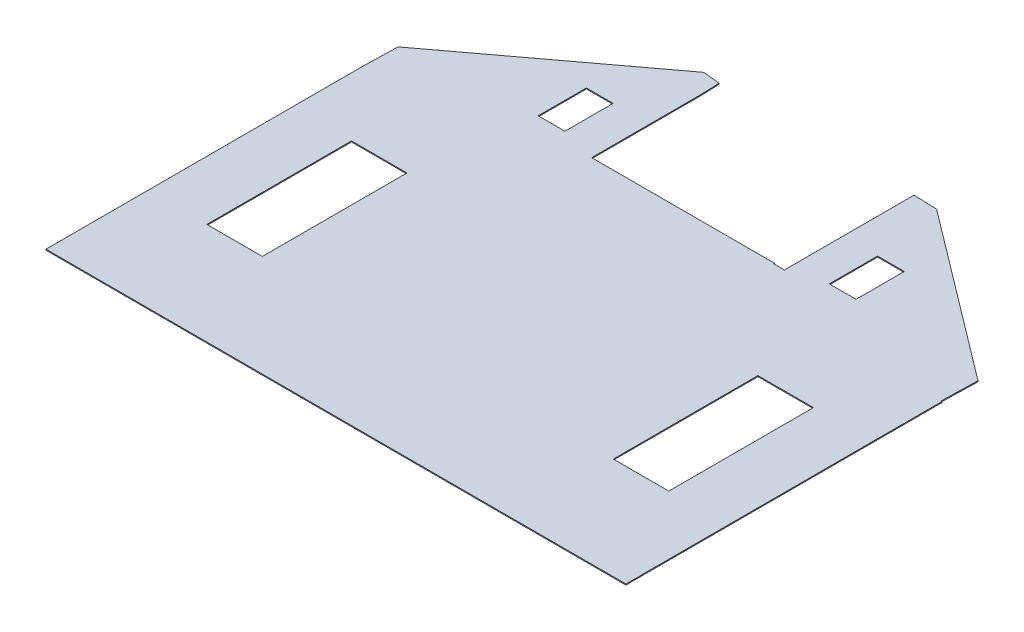
ISO-10303-21;
HEADER;
FILE_DESCRIPTION(('STEP AP214'),'2;1');
FILE_NAME('part.step','',(''),(''),'','','');
FILE_SCHEMA(('AUTOMOTIVE_DESIGN { 1 0 10303 214 1 1 1 1 }'));
ENDSEC;
DATA;
#1=APPLICATION_CONTEXT('core data for automotive mechanical design processes');
#2=APPLICATION_PROTOCOL_DEFINITION('international standard','automotive_design',2000,#1);
#3=PRODUCT_CONTEXT('',#1,'mechanical');
#4=PRODUCT('Part','Part','',(#3));
#5=PRODUCT_RELATED_PRODUCT_CATEGORY('part','',(#4));
#6=PRODUCT_DEFINITION_FORMATION('','',#4);
#7=PRODUCT_DEFINITION_CONTEXT('part definition',#1,'design');
#8=PRODUCT_DEFINITION('design','',#6,#7);
#9=PRODUCT_DEFINITION_SHAPE('','',#8);
#10=(LENGTH_UNIT() NAMED_UNIT(*) SI_UNIT(.MILLI.,.METRE.));
#11=(NAMED_UNIT(*) PLANE_ANGLE_UNIT() SI_UNIT($,.RADIAN.));
#12=(NAMED_UNIT(*) SI_UNIT($,.STERADIAN.) SOLID_ANGLE_UNIT());
#13=UNCERTAINTY_MEASURE_WITH_UNIT(LENGTH_MEASURE(1.E-05),#10,'distance_accuracy_value','');
#14=(GEOMETRIC_REPRESENTATION_CONTEXT(3) GLOBAL_UNCERTAINTY_ASSIGNED_CONTEXT((#13)) GLOBAL_UNIT_ASSIGNED_CONTEXT((#10,
#11,#12)) REPRESENTATION_CONTEXT('',''));
#15=CARTESIAN_POINT('',(0.,0.,0.));
#16=DIRECTION('',(0.,0.,1.));
#17=DIRECTION('',(1.,0.,0.));
#18=AXIS2_PLACEMENT_3D('',#15,#16,#17);
#19=CARTESIAN_POINT('',(0.,1.,0.));
#20=DIRECTION('',(0.,-1.,0.));
#21=DIRECTION('',(0.,0.,-1.));
#22=AXIS2_PLACEMENT_3D('',#19,#20,#21);
#23=PLANE('',#22);
#24=DIRECTION('',(-1.,0.,0.));
#25=VECTOR('',#24,1.);
#26=CARTESIAN_POINT('',(0.,1.,-343.519296460177));
#27=LINE('',#26,#25);
#28=CARTESIAN_POINT('',(98.6389999999998,1.,-343.519296460177));
#29=VERTEX_POINT('',#28);
#30=CARTESIAN_POINT('',(87.7500000000001,1.,-343.519296460177));
#31=VERTEX_POINT('',#30);
#32=EDGE_CURVE('E274',#29,#31,#27,.T.);
#33=ORIENTED_EDGE('',*,*,#32,.T.);
#34=DIRECTION('',(0.,0.,-1.));
#35=VECTOR('',#34,1.);
#36=CARTESIAN_POINT('',(87.7500000000001,1.,0.));
#37=LINE('',#36,#35);
#38=CARTESIAN_POINT('',(87.7500000000001,1.,-344.408296460177));
#39=VERTEX_POINT('',#38);
#40=EDGE_CURVE('E250',#31,#39,#37,.T.);
#41=ORIENTED_EDGE('',*,*,#40,.T.);
#42=DIRECTION('',(1.,0.,0.));
#43=VECTOR('',#42,1.);
#44=CARTESIAN_POINT('',(0.,1.,-344.408296460177));
#45=LINE('',#44,#43);
#46=CARTESIAN_POINT('',(-96.8500000000001,1.,-344.408296460177));
#47=VERTEX_POINT('',#46);
#48=EDGE_CURVE('E402',#47,#39,#45,.T.);
#49=ORIENTED_EDGE('',*,*,#48,.F.);
#50=DIRECTION('',(0.,0.,1.));
#51=VECTOR('',#50,1.);
#52=CARTESIAN_POINT('',(-96.8500000000001,1.,0.));
#53=LINE('',#52,#51);
#54=CARTESIAN_POINT('',(-96.8500000000002,1.,-453.596650434538));
#55=VERTEX_POINT('',#54);
#56=EDGE_CURVE('E405',#55,#47,#53,.T.);
#57=ORIENTED_EDGE('',*,*,#56,.F.);
#58=DIRECTION('',(-0.0366905336563942,0.,-0.999326675687189));
#59=VECTOR('',#58,1.);
#60=CARTESIAN_POINT('',(-97.5901578831756,1.,-473.756060592055));
#61=LINE('',#60,#59);
#62=CARTESIAN_POINT('',(-97.5901578831756,1.,-473.756060592055));
#63=VERTEX_POINT('',#62);
#64=EDGE_CURVE('E297',#55,#63,#61,.T.);
#65=ORIENTED_EDGE('',*,*,#64,.T.);
#66=DIRECTION('',(-0.994284052358785,0.,-0.106767144876095));
#67=VECTOR('',#66,1.);
#68=CARTESIAN_POINT('',(-114.760549692104,1.,-475.599833209643));
#69=LINE('',#68,#67);
#70=CARTESIAN_POINT('',(-114.760549692104,1.,-475.599833209643));
#71=VERTEX_POINT('',#70);
#72=EDGE_CURVE('E315',#63,#71,#69,.T.);
#73=ORIENTED_EDGE('',*,*,#72,.T.);
#74=DIRECTION('',(-0.80080418365876,0.,0.598926255422675));
#75=VECTOR('',#74,1.);
#76=CARTESIAN_POINT('',(-291.361,1.,-343.519296460177));
#77=LINE('',#76,#75);
#78=CARTESIAN_POINT('',(-291.361,1.,-343.519296460177));
#79=VERTEX_POINT('',#78);
#80=EDGE_CURVE('E318',#71,#79,#77,.T.);
#81=ORIENTED_EDGE('',*,*,#80,.T.);
#82=DIRECTION('',(-0.0249634267738826,0.,0.999688365103698));
#83=VECTOR('',#82,1.);
#84=CARTESIAN_POINT('',(-292.25,1.,-307.918296460177));
#85=LINE('',#84,#83);
#86=CARTESIAN_POINT('',(-292.25,1.,-307.918296460177));
#87=VERTEX_POINT('',#86);
#88=EDGE_CURVE('E303',#79,#87,#85,.T.);
#89=ORIENTED_EDGE('',*,*,#88,.T.);
#90=DIRECTION('',(0.,0.,1.));
#91=VECTOR('',#90,1.);
#92=CARTESIAN_POINT('',(-292.25,1.,-307.918296460177));
#93=LINE('',#92,#91);
#94=CARTESIAN_POINT('',(-292.25,1.,10.991703539823));
#95=VERTEX_POINT('',#94);
#96=EDGE_CURVE('E464',#87,#95,#93,.T.);
#97=ORIENTED_EDGE('',*,*,#96,.T.);
#98=DIRECTION('',(1.,0.,0.));
#99=VECTOR('',#98,1.);
#100=CARTESIAN_POINT('',(-292.25,1.,10.991703539823));
#101=LINE('',#100,#99);
#102=CARTESIAN_POINT('',(293.15,1.,10.9917035398231));
#103=VERTEX_POINT('',#102);
#104=EDGE_CURVE('E466',#95,#103,#101,.T.);
#105=ORIENTED_EDGE('',*,*,#104,.T.);
#106=DIRECTION('',(0.,0.,-1.));
#107=VECTOR('',#106,1.);
#108=CARTESIAN_POINT('',(293.15,1.,-307.918296460177));
#109=LINE('',#108,#107);
#110=CARTESIAN_POINT('',(293.15,1.,-307.918296460177));
#111=VERTEX_POINT('',#110);
#112=EDGE_CURVE('E407',#103,#111,#109,.T.);
#113=ORIENTED_EDGE('',*,*,#112,.T.);
#114=DIRECTION('',(-1.,0.,0.));
#115=VECTOR('',#114,1.);
#116=CARTESIAN_POINT('',(292.25,1.,-307.918296460177));
#117=LINE('',#116,#115);
#118=CARTESIAN_POINT('',(292.25,1.,-307.918296460177));
#119=VERTEX_POINT('',#118);
#120=EDGE_CURVE('E408',#111,#119,#117,.T.);
#121=ORIENTED_EDGE('',*,*,#120,.T.);
#122=DIRECTION('',(0.0246567930270433,0.,-0.99969597506323));
#123=VECTOR('',#122,1.);
#124=CARTESIAN_POINT('',(293.15,1.,-344.408296460177));
#125=LINE('',#124,#123);
#126=CARTESIAN_POINT('',(293.15,1.,-344.408296460177));
#127=VERTEX_POINT('',#126);
#128=EDGE_CURVE('E276',#119,#127,#125,.T.);
#129=ORIENTED_EDGE('',*,*,#128,.T.);
#130=DIRECTION('',(-0.797878851672982,0.,-0.602817831565228));
#131=VECTOR('',#130,1.);
#132=CARTESIAN_POINT('',(122.261,1.,-473.519296460177));
#133=LINE('',#132,#131);
#134=CARTESIAN_POINT('',(122.261,1.,-473.519296460177));
#135=VERTEX_POINT('',#134);
#136=EDGE_CURVE('E290',#127,#135,#133,.T.);
#137=ORIENTED_EDGE('',*,*,#136,.T.);
#138=DIRECTION('',(-0.999436890537018,0.,-0.0335544607123688));
#139=VECTOR('',#138,1.);
#140=CARTESIAN_POINT('',(87.7500000000001,1.,-474.677946900849));
#141=LINE('',#140,#139);
#142=CARTESIAN_POINT('',(98.6389999999998,1.,-474.312366516378));
#143=VERTEX_POINT('',#142);
#144=EDGE_CURVE('E281',#135,#143,#141,.T.);
#145=ORIENTED_EDGE('',*,*,#144,.T.);
#146=DIRECTION('',(0.,0.,1.));
#147=VECTOR('',#146,1.);
#148=CARTESIAN_POINT('',(98.6389999999998,1.,0.));
#149=LINE('',#148,#147);
#150=EDGE_CURVE('E49',#143,#29,#149,.T.);
#151=ORIENTED_EDGE('',*,*,#150,.T.);
#152=EDGE_LOOP('',(#33,#41,#49,#57,#65,#73,#81,#89,#97,#105,#113,#121,#129,#137,#145,#151));
#153=FACE_BOUND('',#152,.T.);
#154=DIRECTION('',(-1.,0.,0.));
#155=VECTOR('',#154,1.);
#156=CARTESIAN_POINT('',(0.,1.,-354.012796511557));
#157=LINE('',#156,#155);
#158=CARTESIAN_POINT('',(-133.445577184757,1.,-354.012796511557));
#159=VERTEX_POINT('',#158);
#160=CARTESIAN_POINT('',(-160.445577184757,1.,-354.012796511557));
#161=VERTEX_POINT('',#160);
#162=EDGE_CURVE('E385',#159,#161,#157,.T.);
#163=ORIENTED_EDGE('',*,*,#162,.T.);
#164=DIRECTION('',(0.,0.,-1.));
#165=VECTOR('',#164,1.);
#166=CARTESIAN_POINT('',(-160.445577184757,1.,0.));
#167=LINE('',#166,#165);
#168=CARTESIAN_POINT('',(-160.445577184757,1.,-402.725815016483));
#169=VERTEX_POINT('',#168);
#170=EDGE_CURVE('E394',#161,#169,#167,.T.);
#171=ORIENTED_EDGE('',*,*,#170,.T.);
#172=DIRECTION('',(1.,0.,0.));
#173=VECTOR('',#172,1.);
#174=CARTESIAN_POINT('',(0.,1.,-402.725815016483));
#175=LINE('',#174,#173);
#176=CARTESIAN_POINT('',(-133.445577184757,1.,-402.725815016483));
#177=VERTEX_POINT('',#176);
#178=EDGE_CURVE('E391',#169,#177,#175,.T.);
#179=ORIENTED_EDGE('',*,*,#178,.T.);
#180=DIRECTION('',(0.,0.,1.));
#181=VECTOR('',#180,1.);
#182=CARTESIAN_POINT('',(-133.445577184757,1.,0.));
#183=LINE('',#182,#181);
#184=EDGE_CURVE('E388',#177,#159,#183,.T.);
#185=ORIENTED_EDGE('',*,*,#184,.T.);
#186=EDGE_LOOP('',(#163,#171,#179,#185));
#187=FACE_BOUND('',#186,.T.);
#188=DIRECTION('',(1.,0.,0.));
#189=VECTOR('',#188,1.);
#190=CARTESIAN_POINT('',(0.,1.,-402.725815016483));
#191=LINE('',#190,#189);
#192=CARTESIAN_POINT('',(133.445577184757,1.,-402.725815016483));
#193=VERTEX_POINT('',#192);
#194=CARTESIAN_POINT('',(160.445577184757,1.,-402.725815016483));
#195=VERTEX_POINT('',#194);
#196=EDGE_CURVE('E345',#193,#195,#191,.T.);
#197=ORIENTED_EDGE('',*,*,#196,.T.);
#198=DIRECTION('',(0.,0.,1.));
#199=VECTOR('',#198,1.);
#200=CARTESIAN_POINT('',(160.445577184757,1.,0.));
#201=LINE('',#200,#199);
#202=CARTESIAN_POINT('',(160.445577184757,1.,-354.012796511557));
#203=VERTEX_POINT('',#202);
#204=EDGE_CURVE('E382',#195,#203,#201,.T.);
#205=ORIENTED_EDGE('',*,*,#204,.T.);
#206=DIRECTION('',(-1.,0.,0.));
#207=VECTOR('',#206,1.);
#208=CARTESIAN_POINT('',(0.,1.,-354.012796511557));
#209=LINE('',#208,#207);
#210=CARTESIAN_POINT('',(133.445577184757,1.,-354.012796511557));
#211=VERTEX_POINT('',#210);
#212=EDGE_CURVE('E379',#203,#211,#209,.T.);
#213=ORIENTED_EDGE('',*,*,#212,.T.);
#214=DIRECTION('',(0.,0.,-1.));
#215=VECTOR('',#214,1.);
#216=CARTESIAN_POINT('',(133.445577184757,1.,0.));
#217=LINE('',#216,#215);
#218=EDGE_CURVE('E376',#211,#193,#217,.T.);
#219=ORIENTED_EDGE('',*,*,#218,.T.);
#220=EDGE_LOOP('',(#197,#205,#213,#219));
#221=FACE_BOUND('',#220,.T.);
#222=DIRECTION('',(1.,0.,0.));
#223=VECTOR('',#222,1.);
#224=CARTESIAN_POINT('',(177.588244908517,1.,-91.8344648344604));
#225=LINE('',#224,#223);
#226=CARTESIAN_POINT('',(177.588244908517,1.,-91.8344648344604));
#227=VERTEX_POINT('',#226);
#228=CARTESIAN_POINT('',(233.588244908517,1.,-91.8344648344604));
#229=VERTEX_POINT('',#228);
#230=EDGE_CURVE('E447',#227,#229,#225,.T.);
#231=ORIENTED_EDGE('',*,*,#230,.F.);
#232=DIRECTION('',(0.,0.,1.));
#233=VECTOR('',#232,1.);
#234=CARTESIAN_POINT('',(177.588244908517,1.,-237.83446483446));
#235=LINE('',#234,#233);
#236=CARTESIAN_POINT('',(177.588244908517,1.,-237.83446483446));
#237=VERTEX_POINT('',#236);
#238=EDGE_CURVE('E416',#237,#227,#235,.T.);
#239=ORIENTED_EDGE('',*,*,#238,.F.);
#240=DIRECTION('',(-1.,0.,0.));
#241=VECTOR('',#240,1.);
#242=CARTESIAN_POINT('',(177.588244908517,1.,-237.83446483446));
#243=LINE('',#242,#241);
#244=CARTESIAN_POINT('',(233.588244908517,1.,-237.83446483446));
#245=VERTEX_POINT('',#244);
#246=EDGE_CURVE('E453',#245,#237,#243,.T.);
#247=ORIENTED_EDGE('',*,*,#246,.F.);
#248=DIRECTION('',(0.,0.,-1.));
#249=VECTOR('',#248,1.);
#250=CARTESIAN_POINT('',(233.588244908517,1.,-237.83446483446));
#251=LINE('',#250,#249);
#252=EDGE_CURVE('E450',#229,#245,#251,.T.);
#253=ORIENTED_EDGE('',*,*,#252,.F.);
#254=EDGE_LOOP('',(#231,#239,#247,#253));
#255=FACE_BOUND('',#254,.T.);
#256=DIRECTION('',(1.,0.,0.));
#257=VECTOR('',#256,1.);
#258=CARTESIAN_POINT('',(-232.688244908518,1.,-91.8344648344604));
#259=LINE('',#258,#257);
#260=CARTESIAN_POINT('',(-232.688244908518,1.,-91.8344648344604));
#261=VERTEX_POINT('',#260);
#262=CARTESIAN_POINT('',(-176.688244908518,1.,-91.8344648344604));
#263=VERTEX_POINT('',#262);
#264=EDGE_CURVE('E426',#261,#263,#259,.T.);
#265=ORIENTED_EDGE('',*,*,#264,.F.);
#266=DIRECTION('',(0.,0.,1.));
#267=VECTOR('',#266,1.);
#268=CARTESIAN_POINT('',(-232.688244908518,1.,-237.83446483446));
#269=LINE('',#268,#267);
#270=CARTESIAN_POINT('',(-232.688244908518,1.,-237.83446483446));
#271=VERTEX_POINT('',#270);
#272=EDGE_CURVE('E424',#271,#261,#269,.T.);
#273=ORIENTED_EDGE('',*,*,#272,.F.);
#274=DIRECTION('',(-1.,0.,0.));
#275=VECTOR('',#274,1.);
#276=CARTESIAN_POINT('',(-232.688244908518,1.,-237.83446483446));
#277=LINE('',#276,#275);
#278=CARTESIAN_POINT('',(-176.688244908518,1.,-237.83446483446));
#279=VERTEX_POINT('',#278);
#280=EDGE_CURVE('E433',#279,#271,#277,.T.);
#281=ORIENTED_EDGE('',*,*,#280,.F.);
#282=DIRECTION('',(0.,0.,-1.));
#283=VECTOR('',#282,1.);
#284=CARTESIAN_POINT('',(-176.688244908518,1.,-237.83446483446));
#285=LINE('',#284,#283);
#286=EDGE_CURVE('E430',#263,#279,#285,.T.);
#287=ORIENTED_EDGE('',*,*,#286,.F.);
#288=EDGE_LOOP('',(#265,#273,#281,#287));
#289=FACE_BOUND('',#288,.T.);
#290=ADVANCED_FACE('F35',(#153,#187,#221,#255,#289),#23,.F.);
#291=CARTESIAN_POINT('',(0.,0.,0.));
#292=DIRECTION('',(0.,-1.,0.));
#293=DIRECTION('',(0.,0.,-1.));
#294=AXIS2_PLACEMENT_3D('',#291,#292,#293);
#295=PLANE('',#294);
#296=DIRECTION('',(0.,0.,1.));
#297=VECTOR('',#296,1.);
#298=CARTESIAN_POINT('',(87.7500000000001,0.,-343.519296460177));
#299=LINE('',#298,#297);
#300=CARTESIAN_POINT('',(87.7500000000001,0.,-344.408296460177));
#301=VERTEX_POINT('',#300);
#302=CARTESIAN_POINT('',(87.7500000000001,0.,-343.519296460177));
#303=VERTEX_POINT('',#302);
#304=EDGE_CURVE('E247',#301,#303,#299,.T.);
#305=ORIENTED_EDGE('',*,*,#304,.T.);
#306=DIRECTION('',(1.,0.,0.));
#307=VECTOR('',#306,1.);
#308=CARTESIAN_POINT('',(98.6389999999998,0.,-343.519296460177));
#309=LINE('',#308,#307);
#310=CARTESIAN_POINT('',(98.6389999999998,0.,-343.519296460177));
#311=VERTEX_POINT('',#310);
#312=EDGE_CURVE('E257',#303,#311,#309,.T.);
#313=ORIENTED_EDGE('',*,*,#312,.T.);
#314=DIRECTION('',(0.,0.,-1.));
#315=VECTOR('',#314,1.);
#316=CARTESIAN_POINT('',(98.6389999999998,0.,-474.408296460177));
#317=LINE('',#316,#315);
#318=CARTESIAN_POINT('',(98.6389999999998,0.,-474.312366516378));
#319=VERTEX_POINT('',#318);
#320=EDGE_CURVE('E254',#311,#319,#317,.T.);
#321=ORIENTED_EDGE('',*,*,#320,.T.);
#322=DIRECTION('',(-0.999436890537018,0.,-0.0335544607123688));
#323=VECTOR('',#322,1.);
#324=CARTESIAN_POINT('',(87.7500000000001,0.,-474.677946900849));
#325=LINE('',#324,#323);
#326=CARTESIAN_POINT('',(122.261,0.,-473.519296460177));
#327=VERTEX_POINT('',#326);
#328=EDGE_CURVE('E284',#327,#319,#325,.T.);
#329=ORIENTED_EDGE('',*,*,#328,.F.);
#330=DIRECTION('',(-0.797878851672982,0.,-0.602817831565228));
#331=VECTOR('',#330,1.);
#332=CARTESIAN_POINT('',(122.261,0.,-473.519296460177));
#333=LINE('',#332,#331);
#334=CARTESIAN_POINT('',(293.15,0.,-344.408296460177));
#335=VERTEX_POINT('',#334);
#336=EDGE_CURVE('E280',#335,#327,#333,.T.);
#337=ORIENTED_EDGE('',*,*,#336,.F.);
#338=DIRECTION('',(0.0246567930270433,0.,-0.99969597506323));
#339=VECTOR('',#338,1.);
#340=CARTESIAN_POINT('',(293.15,0.,-344.408296460177));
#341=LINE('',#340,#339);
#342=CARTESIAN_POINT('',(292.25,0.,-307.918296460177));
#343=VERTEX_POINT('',#342);
#344=EDGE_CURVE('E277',#343,#335,#341,.T.);
#345=ORIENTED_EDGE('',*,*,#344,.F.);
#346=DIRECTION('',(-1.,0.,0.));
#347=VECTOR('',#346,1.);
#348=CARTESIAN_POINT('',(292.25,0.,-307.918296460177));
#349=LINE('',#348,#347);
#350=CARTESIAN_POINT('',(293.15,0.,-307.918296460177));
#351=VERTEX_POINT('',#350);
#352=EDGE_CURVE('E414',#351,#343,#349,.T.);
#353=ORIENTED_EDGE('',*,*,#352,.F.);
#354=DIRECTION('',(0.,0.,-1.));
#355=VECTOR('',#354,1.);
#356=CARTESIAN_POINT('',(293.15,0.,-307.918296460177));
#357=LINE('',#356,#355);
#358=CARTESIAN_POINT('',(293.15,0.,10.9917035398231));
#359=VERTEX_POINT('',#358);
#360=EDGE_CURVE('E418',#359,#351,#357,.T.);
#361=ORIENTED_EDGE('',*,*,#360,.F.);
#362=DIRECTION('',(1.,0.,0.));
#363=VECTOR('',#362,1.);
#364=CARTESIAN_POINT('',(-292.25,0.,10.991703539823));
#365=LINE('',#364,#363);
#366=CARTESIAN_POINT('',(-292.25,0.,10.991703539823));
#367=VERTEX_POINT('',#366);
#368=EDGE_CURVE('E467',#367,#359,#365,.T.);
#369=ORIENTED_EDGE('',*,*,#368,.F.);
#370=DIRECTION('',(0.,0.,1.));
#371=VECTOR('',#370,1.);
#372=CARTESIAN_POINT('',(-292.25,0.,-307.918296460177));
#373=LINE('',#372,#371);
#374=CARTESIAN_POINT('',(-292.25,0.,-307.918296460177));
#375=VERTEX_POINT('',#374);
#376=EDGE_CURVE('E439',#375,#367,#373,.T.);
#377=ORIENTED_EDGE('',*,*,#376,.F.);
#378=DIRECTION('',(-0.0249634267738826,0.,0.999688365103698));
#379=VECTOR('',#378,1.);
#380=CARTESIAN_POINT('',(-292.25,0.,-307.918296460177));
#381=LINE('',#380,#379);
#382=CARTESIAN_POINT('',(-291.361,0.,-343.519296460177));
#383=VERTEX_POINT('',#382);
#384=EDGE_CURVE('E309',#383,#375,#381,.T.);
#385=ORIENTED_EDGE('',*,*,#384,.F.);
#386=DIRECTION('',(-0.80080418365876,0.,0.598926255422675));
#387=VECTOR('',#386,1.);
#388=CARTESIAN_POINT('',(-291.361,0.,-343.519296460177));
#389=LINE('',#388,#387);
#390=CARTESIAN_POINT('',(-114.760549692104,0.,-475.599833209643));
#391=VERTEX_POINT('',#390);
#392=EDGE_CURVE('E306',#391,#383,#389,.T.);
#393=ORIENTED_EDGE('',*,*,#392,.F.);
#394=DIRECTION('',(-0.994284052358785,0.,-0.106767144876095));
#395=VECTOR('',#394,1.);
#396=CARTESIAN_POINT('',(-114.760549692104,0.,-475.599833209643));
#397=LINE('',#396,#395);
#398=CARTESIAN_POINT('',(-97.5901578831756,0.,-473.756060592055));
#399=VERTEX_POINT('',#398);
#400=EDGE_CURVE('E302',#399,#391,#397,.T.);
#401=ORIENTED_EDGE('',*,*,#400,.F.);
#402=DIRECTION('',(-0.0366905336563942,0.,-0.999326675687189));
#403=VECTOR('',#402,1.);
#404=CARTESIAN_POINT('',(-97.5901578831756,0.,-473.756060592055));
#405=LINE('',#404,#403);
#406=CARTESIAN_POINT('',(-96.8500000000002,0.,-453.596650434538));
#407=VERTEX_POINT('',#406);
#408=EDGE_CURVE('E299',#407,#399,#405,.T.);
#409=ORIENTED_EDGE('',*,*,#408,.F.);
#410=DIRECTION('',(0.,0.,1.));
#411=VECTOR('',#410,1.);
#412=CARTESIAN_POINT('',(-96.8500000000001,0.,0.));
#413=LINE('',#412,#411);
#414=CARTESIAN_POINT('',(-96.8500000000001,0.,-344.408296460177));
#415=VERTEX_POINT('',#414);
#416=EDGE_CURVE('E499',#407,#415,#413,.T.);
#417=ORIENTED_EDGE('',*,*,#416,.T.);
#418=DIRECTION('',(1.,0.,0.));
#419=VECTOR('',#418,1.);
#420=CARTESIAN_POINT('',(0.,0.,-344.408296460177));
#421=LINE('',#420,#419);
#422=EDGE_CURVE('E267',#415,#301,#421,.T.);
#423=ORIENTED_EDGE('',*,*,#422,.T.);
#424=EDGE_LOOP('',(#305,#313,#321,#329,#337,#345,#353,#361,#369,#377,#385,#393,#401,#409,#417,#423));
#425=FACE_BOUND('',#424,.T.);
#426=DIRECTION('',(0.,0.,1.));
#427=VECTOR('',#426,1.);
#428=CARTESIAN_POINT('',(-160.445577184757,0.,-402.725815016483));
#429=LINE('',#428,#427);
#430=CARTESIAN_POINT('',(-160.445577184757,0.,-402.725815016483));
#431=VERTEX_POINT('',#430);
#432=CARTESIAN_POINT('',(-160.445577184757,0.,-354.012796511557));
#433=VERTEX_POINT('',#432);
#434=EDGE_CURVE('E329',#431,#433,#429,.T.);
#435=ORIENTED_EDGE('',*,*,#434,.T.);
#436=DIRECTION('',(1.,0.,0.));
#437=VECTOR('',#436,1.);
#438=CARTESIAN_POINT('',(-160.445577184757,0.,-354.012796511557));
#439=LINE('',#438,#437);
#440=CARTESIAN_POINT('',(-133.445577184757,0.,-354.012796511557));
#441=VERTEX_POINT('',#440);
#442=EDGE_CURVE('E332',#433,#441,#439,.T.);
#443=ORIENTED_EDGE('',*,*,#442,.T.);
#444=DIRECTION('',(0.,0.,-1.));
#445=VECTOR('',#444,1.);
#446=CARTESIAN_POINT('',(-133.445577184757,0.,-402.725815016483));
#447=LINE('',#446,#445);
#448=CARTESIAN_POINT('',(-133.445577184757,0.,-402.725815016483));
#449=VERTEX_POINT('',#448);
#450=EDGE_CURVE('E336',#441,#449,#447,.T.);
#451=ORIENTED_EDGE('',*,*,#450,.T.);
#452=DIRECTION('',(-1.,0.,0.));
#453=VECTOR('',#452,1.);
#454=CARTESIAN_POINT('',(-160.445577184757,0.,-402.725815016483));
#455=LINE('',#454,#453);
#456=EDGE_CURVE('E339',#449,#431,#455,.T.);
#457=ORIENTED_EDGE('',*,*,#456,.T.);
#458=EDGE_LOOP('',(#435,#443,#451,#457));
#459=FACE_BOUND('',#458,.T.);
#460=DIRECTION('',(0.,0.,-1.));
#461=VECTOR('',#460,1.);
#462=CARTESIAN_POINT('',(160.445577184757,0.,-402.725815016483));
#463=LINE('',#462,#461);
#464=CARTESIAN_POINT('',(160.445577184757,0.,-354.012796511557));
#465=VERTEX_POINT('',#464);
#466=CARTESIAN_POINT('',(160.445577184757,0.,-402.725815016483));
#467=VERTEX_POINT('',#466);
#468=EDGE_CURVE('E325',#465,#467,#463,.T.);
#469=ORIENTED_EDGE('',*,*,#468,.T.);
#470=DIRECTION('',(-1.,0.,0.));
#471=VECTOR('',#470,1.);
#472=CARTESIAN_POINT('',(160.445577184757,0.,-402.725815016483));
#473=LINE('',#472,#471);
#474=CARTESIAN_POINT('',(133.445577184757,0.,-402.725815016483));
#475=VERTEX_POINT('',#474);
#476=EDGE_CURVE('E355',#467,#475,#473,.T.);
#477=ORIENTED_EDGE('',*,*,#476,.T.);
#478=DIRECTION('',(0.,0.,1.));
#479=VECTOR('',#478,1.);
#480=CARTESIAN_POINT('',(133.445577184757,0.,-402.725815016483));
#481=LINE('',#480,#479);
#482=CARTESIAN_POINT('',(133.445577184757,0.,-354.012796511557));
#483=VERTEX_POINT('',#482);
#484=EDGE_CURVE('E358',#475,#483,#481,.T.);
#485=ORIENTED_EDGE('',*,*,#484,.T.);
#486=DIRECTION('',(1.,0.,0.));
#487=VECTOR('',#486,1.);
#488=CARTESIAN_POINT('',(160.445577184757,0.,-354.012796511557));
#489=LINE('',#488,#487);
#490=EDGE_CURVE('E361',#483,#465,#489,.T.);
#491=ORIENTED_EDGE('',*,*,#490,.T.);
#492=EDGE_LOOP('',(#469,#477,#485,#491));
#493=FACE_BOUND('',#492,.T.);
#494=DIRECTION('',(0.,0.,-1.));
#495=VECTOR('',#494,1.);
#496=CARTESIAN_POINT('',(-232.688244908518,0.,0.));
#497=LINE('',#496,#495);
#498=CARTESIAN_POINT('',(-232.688244908518,0.,-91.8344648344604));
#499=VERTEX_POINT('',#498);
#500=CARTESIAN_POINT('',(-232.688244908518,0.,-237.83446483446));
#501=VERTEX_POINT('',#500);
#502=EDGE_CURVE('E496',#499,#501,#497,.T.);
#503=ORIENTED_EDGE('',*,*,#502,.F.);
#504=DIRECTION('',(-1.,0.,0.));
#505=VECTOR('',#504,1.);
#506=CARTESIAN_POINT('',(0.,0.,-91.8344648344604));
#507=LINE('',#506,#505);
#508=CARTESIAN_POINT('',(-176.688244908518,0.,-91.8344648344604));
#509=VERTEX_POINT('',#508);
#510=EDGE_CURVE('E489',#509,#499,#507,.T.);
#511=ORIENTED_EDGE('',*,*,#510,.F.);
#512=DIRECTION('',(0.,0.,1.));
#513=VECTOR('',#512,1.);
#514=CARTESIAN_POINT('',(-176.688244908518,0.,0.));
#515=LINE('',#514,#513);
#516=CARTESIAN_POINT('',(-176.688244908518,0.,-237.83446483446));
#517=VERTEX_POINT('',#516);
#518=EDGE_CURVE('E491',#517,#509,#515,.T.);
#519=ORIENTED_EDGE('',*,*,#518,.F.);
#520=DIRECTION('',(1.,0.,0.));
#521=VECTOR('',#520,1.);
#522=CARTESIAN_POINT('',(0.,0.,-237.83446483446));
#523=LINE('',#522,#521);
#524=EDGE_CURVE('E494',#501,#517,#523,.T.);
#525=ORIENTED_EDGE('',*,*,#524,.F.);
#526=EDGE_LOOP('',(#503,#511,#519,#525));
#527=FACE_BOUND('',#526,.T.);
#528=DIRECTION('',(0.,0.,-1.));
#529=VECTOR('',#528,1.);
#530=CARTESIAN_POINT('',(177.588244908517,0.,0.));
#531=LINE('',#530,#529);
#532=CARTESIAN_POINT('',(177.588244908517,0.,-91.8344648344604));
#533=VERTEX_POINT('',#532);
#534=CARTESIAN_POINT('',(177.588244908517,0.,-237.83446483446));
#535=VERTEX_POINT('',#534);
#536=EDGE_CURVE('E487',#533,#535,#531,.T.);
#537=ORIENTED_EDGE('',*,*,#536,.F.);
#538=DIRECTION('',(-1.,0.,0.));
#539=VECTOR('',#538,1.);
#540=CARTESIAN_POINT('',(0.,0.,-91.8344648344604));
#541=LINE('',#540,#539);
#542=CARTESIAN_POINT('',(233.588244908517,0.,-91.8344648344604));
#543=VERTEX_POINT('',#542);
#544=EDGE_CURVE('E480',#543,#533,#541,.T.);
#545=ORIENTED_EDGE('',*,*,#544,.F.);
#546=DIRECTION('',(0.,0.,1.));
#547=VECTOR('',#546,1.);
#548=CARTESIAN_POINT('',(233.588244908517,0.,0.));
#549=LINE('',#548,#547);
#550=CARTESIAN_POINT('',(233.588244908517,0.,-237.83446483446));
#551=VERTEX_POINT('',#550);
#552=EDGE_CURVE('E482',#551,#543,#549,.T.);
#553=ORIENTED_EDGE('',*,*,#552,.F.);
#554=DIRECTION('',(1.,0.,0.));
#555=VECTOR('',#554,1.);
#556=CARTESIAN_POINT('',(0.,0.,-237.83446483446));
#557=LINE('',#556,#555);
#558=EDGE_CURVE('E485',#535,#551,#557,.T.);
#559=ORIENTED_EDGE('',*,*,#558,.F.);
#560=EDGE_LOOP('',(#537,#545,#553,#559));
#561=FACE_BOUND('',#560,.T.);
#562=ADVANCED_FACE('F264',(#425,#459,#493,#527,#561),#295,.T.);
#563=CARTESIAN_POINT('',(-292.25,1.,-307.918296460177));
#564=DIRECTION('',(1.,0.,0.));
#565=DIRECTION('',(0.,0.,-1.));
#566=AXIS2_PLACEMENT_3D('',#563,#564,#565);
#567=PLANE('',#566);
#568=ORIENTED_EDGE('',*,*,#376,.T.);
#569=DIRECTION('',(0.,-1.,0.));
#570=VECTOR('',#569,1.);
#571=CARTESIAN_POINT('',(-292.25,1.,10.991703539823));
#572=LINE('',#571,#570);
#573=EDGE_CURVE('E474',#95,#367,#572,.T.);
#574=ORIENTED_EDGE('',*,*,#573,.F.);
#575=ORIENTED_EDGE('',*,*,#96,.F.);
#576=DIRECTION('',(0.,-1.,0.));
#577=VECTOR('',#576,1.);
#578=CARTESIAN_POINT('',(-292.25,1.,-307.918296460177));
#579=LINE('',#578,#577);
#580=EDGE_CURVE('E477',#87,#375,#579,.T.);
#581=ORIENTED_EDGE('',*,*,#580,.T.);
#582=EDGE_LOOP('',(#568,#574,#575,#581));
#583=FACE_BOUND('',#582,.T.);
#584=ADVANCED_FACE('F37',(#583),#567,.F.);
#585=CARTESIAN_POINT('',(-292.25,1.,10.991703539823));
#586=DIRECTION('',(0.,0.,-1.));
#587=DIRECTION('',(-1.,0.,0.));
#588=AXIS2_PLACEMENT_3D('',#585,#586,#587);
#589=PLANE('',#588);
#590=ORIENTED_EDGE('',*,*,#368,.T.);
#591=DIRECTION('',(0.,1.,0.));
#592=VECTOR('',#591,1.);
#593=CARTESIAN_POINT('',(293.15,-318.911269948241,10.9917035398231));
#594=LINE('',#593,#592);
#595=EDGE_CURVE('E411',#359,#103,#594,.T.);
#596=ORIENTED_EDGE('',*,*,#595,.T.);
#597=ORIENTED_EDGE('',*,*,#104,.F.);
#598=ORIENTED_EDGE('',*,*,#573,.T.);
#599=EDGE_LOOP('',(#590,#596,#597,#598));
#600=FACE_BOUND('',#599,.T.);
#601=ADVANCED_FACE('F546',(#600),#589,.F.);
#602=CARTESIAN_POINT('',(177.588244908517,-9.,-237.83446483446));
#603=DIRECTION('',(-1.,0.,0.));
#604=DIRECTION('',(0.,0.,1.));
#605=AXIS2_PLACEMENT_3D('',#602,#603,#604);
#606=PLANE('',#605);
#607=ORIENTED_EDGE('',*,*,#536,.T.);
#608=DIRECTION('',(0.,1.,0.));
#609=VECTOR('',#608,1.);
#610=CARTESIAN_POINT('',(177.588244908517,-9.,-237.83446483446));
#611=LINE('',#610,#609);
#612=EDGE_CURVE('E427',#535,#237,#611,.T.);
#613=ORIENTED_EDGE('',*,*,#612,.T.);
#614=ORIENTED_EDGE('',*,*,#238,.T.);
#615=DIRECTION('',(0.,1.,0.));
#616=VECTOR('',#615,1.);
#617=CARTESIAN_POINT('',(177.588244908517,-9.,-91.8344648344604));
#618=LINE('',#617,#616);
#619=EDGE_CURVE('E456',#533,#227,#618,.T.);
#620=ORIENTED_EDGE('',*,*,#619,.F.);
#621=EDGE_LOOP('',(#607,#613,#614,#620));
#622=FACE_BOUND('',#621,.T.);
#623=ADVANCED_FACE('F571',(#622),#606,.F.);
#624=CARTESIAN_POINT('',(177.588244908517,-9.,-237.83446483446));
#625=DIRECTION('',(0.,0.,-1.));
#626=DIRECTION('',(-1.,0.,0.));
#627=AXIS2_PLACEMENT_3D('',#624,#625,#626);
#628=PLANE('',#627);
#629=ORIENTED_EDGE('',*,*,#558,.T.);
#630=DIRECTION('',(0.,1.,0.));
#631=VECTOR('',#630,1.);
#632=CARTESIAN_POINT('',(233.588244908517,-9.,-237.83446483446));
#633=LINE('',#632,#631);
#634=EDGE_CURVE('E458',#551,#245,#633,.T.);
#635=ORIENTED_EDGE('',*,*,#634,.T.);
#636=ORIENTED_EDGE('',*,*,#246,.T.);
#637=ORIENTED_EDGE('',*,*,#612,.F.);
#638=EDGE_LOOP('',(#629,#635,#636,#637));
#639=FACE_BOUND('',#638,.T.);
#640=ADVANCED_FACE('F578',(#639),#628,.F.);
#641=CARTESIAN_POINT('',(233.588244908517,-9.,-237.83446483446));
#642=DIRECTION('',(1.,0.,0.));
#643=DIRECTION('',(0.,0.,-1.));
#644=AXIS2_PLACEMENT_3D('',#641,#642,#643);
#645=PLANE('',#644);
#646=ORIENTED_EDGE('',*,*,#552,.T.);
#647=DIRECTION('',(0.,1.,0.));
#648=VECTOR('',#647,1.);
#649=CARTESIAN_POINT('',(233.588244908517,-9.,-91.8344648344604));
#650=LINE('',#649,#648);
#651=EDGE_CURVE('E460',#543,#229,#650,.T.);
#652=ORIENTED_EDGE('',*,*,#651,.T.);
#653=ORIENTED_EDGE('',*,*,#252,.T.);
#654=ORIENTED_EDGE('',*,*,#634,.F.);
#655=EDGE_LOOP('',(#646,#652,#653,#654));
#656=FACE_BOUND('',#655,.T.);
#657=ADVANCED_FACE('F738',(#656),#645,.F.);
#658=CARTESIAN_POINT('',(177.588244908517,-9.,-91.8344648344604));
#659=DIRECTION('',(0.,0.,1.));
#660=DIRECTION('',(1.,0.,0.));
#661=AXIS2_PLACEMENT_3D('',#658,#659,#660);
#662=PLANE('',#661);
#663=ORIENTED_EDGE('',*,*,#544,.T.);
#664=ORIENTED_EDGE('',*,*,#619,.T.);
#665=ORIENTED_EDGE('',*,*,#230,.T.);
#666=ORIENTED_EDGE('',*,*,#651,.F.);
#667=EDGE_LOOP('',(#663,#664,#665,#666));
#668=FACE_BOUND('',#667,.T.);
#669=ADVANCED_FACE('F730',(#668),#662,.F.);
#670=CARTESIAN_POINT('',(-232.688244908518,-9.,-237.83446483446));
#671=DIRECTION('',(-1.,0.,0.));
#672=DIRECTION('',(0.,0.,1.));
#673=AXIS2_PLACEMENT_3D('',#670,#671,#672);
#674=PLANE('',#673);
#675=ORIENTED_EDGE('',*,*,#502,.T.);
#676=DIRECTION('',(0.,1.,0.));
#677=VECTOR('',#676,1.);
#678=CARTESIAN_POINT('',(-232.688244908518,-9.,-237.83446483446));
#679=LINE('',#678,#677);
#680=EDGE_CURVE('E437',#501,#271,#679,.T.);
#681=ORIENTED_EDGE('',*,*,#680,.T.);
#682=ORIENTED_EDGE('',*,*,#272,.T.);
#683=DIRECTION('',(0.,1.,0.));
#684=VECTOR('',#683,1.);
#685=CARTESIAN_POINT('',(-232.688244908518,-9.,-91.8344648344604));
#686=LINE('',#685,#684);
#687=EDGE_CURVE('E436',#499,#261,#686,.T.);
#688=ORIENTED_EDGE('',*,*,#687,.F.);
#689=EDGE_LOOP('',(#675,#681,#682,#688));
#690=FACE_BOUND('',#689,.T.);
#691=ADVANCED_FACE('F722',(#690),#674,.F.);
#692=CARTESIAN_POINT('',(-232.688244908518,-9.,-237.83446483446));
#693=DIRECTION('',(0.,0.,-1.));
#694=DIRECTION('',(-1.,0.,0.));
#695=AXIS2_PLACEMENT_3D('',#692,#693,#694);
#696=PLANE('',#695);
#697=ORIENTED_EDGE('',*,*,#524,.T.);
#698=DIRECTION('',(0.,1.,0.));
#699=VECTOR('',#698,1.);
#700=CARTESIAN_POINT('',(-176.688244908518,-9.,-237.83446483446));
#701=LINE('',#700,#699);
#702=EDGE_CURVE('E440',#517,#279,#701,.T.);
#703=ORIENTED_EDGE('',*,*,#702,.T.);
#704=ORIENTED_EDGE('',*,*,#280,.T.);
#705=ORIENTED_EDGE('',*,*,#680,.F.);
#706=EDGE_LOOP('',(#697,#703,#704,#705));
#707=FACE_BOUND('',#706,.T.);
#708=ADVANCED_FACE('F714',(#707),#696,.F.);
#709=CARTESIAN_POINT('',(-176.688244908518,-9.,-237.83446483446));
#710=DIRECTION('',(1.,0.,0.));
#711=DIRECTION('',(0.,0.,-1.));
#712=AXIS2_PLACEMENT_3D('',#709,#710,#711);
#713=PLANE('',#712);
#714=ORIENTED_EDGE('',*,*,#518,.T.);
#715=DIRECTION('',(0.,1.,0.));
#716=VECTOR('',#715,1.);
#717=CARTESIAN_POINT('',(-176.688244908518,-9.,-91.8344648344604));
#718=LINE('',#717,#716);
#719=EDGE_CURVE('E442',#509,#263,#718,.T.);
#720=ORIENTED_EDGE('',*,*,#719,.T.);
#721=ORIENTED_EDGE('',*,*,#286,.T.);
#722=ORIENTED_EDGE('',*,*,#702,.F.);
#723=EDGE_LOOP('',(#714,#720,#721,#722));
#724=FACE_BOUND('',#723,.T.);
#725=ADVANCED_FACE('F706',(#724),#713,.F.);
#726=CARTESIAN_POINT('',(-232.688244908518,-9.,-91.8344648344604));
#727=DIRECTION('',(0.,0.,1.));
#728=DIRECTION('',(1.,0.,0.));
#729=AXIS2_PLACEMENT_3D('',#726,#727,#728);
#730=PLANE('',#729);
#731=ORIENTED_EDGE('',*,*,#510,.T.);
#732=ORIENTED_EDGE('',*,*,#687,.T.);
#733=ORIENTED_EDGE('',*,*,#264,.T.);
#734=ORIENTED_EDGE('',*,*,#719,.F.);
#735=EDGE_LOOP('',(#731,#732,#733,#734));
#736=FACE_BOUND('',#735,.T.);
#737=ADVANCED_FACE('F699',(#736),#730,.F.);
#738=CARTESIAN_POINT('',(293.15,-318.911269948241,-307.918296460177));
#739=DIRECTION('',(1.,0.,0.));
#740=DIRECTION('',(0.,0.,-1.));
#741=AXIS2_PLACEMENT_3D('',#738,#739,#740);
#742=PLANE('',#741);
#743=ORIENTED_EDGE('',*,*,#595,.F.);
#744=ORIENTED_EDGE('',*,*,#360,.T.);
#745=DIRECTION('',(0.,1.,0.));
#746=VECTOR('',#745,1.);
#747=CARTESIAN_POINT('',(293.15,-318.911269948241,-307.918296460177));
#748=LINE('',#747,#746);
#749=EDGE_CURVE('E417',#351,#111,#748,.T.);
#750=ORIENTED_EDGE('',*,*,#749,.T.);
#751=ORIENTED_EDGE('',*,*,#112,.F.);
#752=EDGE_LOOP('',(#743,#744,#750,#751));
#753=FACE_BOUND('',#752,.T.);
#754=ADVANCED_FACE('F542',(#753),#742,.T.);
#755=CARTESIAN_POINT('',(292.25,-318.911269948241,-307.918296460177));
#756=DIRECTION('',(0.,0.,-1.));
#757=DIRECTION('',(-1.,0.,0.));
#758=AXIS2_PLACEMENT_3D('',#755,#756,#757);
#759=PLANE('',#758);
#760=ORIENTED_EDGE('',*,*,#749,.F.);
#761=ORIENTED_EDGE('',*,*,#352,.T.);
#762=DIRECTION('',(0.,-1.,0.));
#763=VECTOR('',#762,1.);
#764=CARTESIAN_POINT('',(292.25,1.,-307.918296460177));
#765=LINE('',#764,#763);
#766=EDGE_CURVE('E469',#119,#343,#765,.T.);
#767=ORIENTED_EDGE('',*,*,#766,.F.);
#768=ORIENTED_EDGE('',*,*,#120,.F.);
#769=EDGE_LOOP('',(#760,#761,#767,#768));
#770=FACE_BOUND('',#769,.T.);
#771=ADVANCED_FACE('F537',(#770),#759,.T.);
#772=CARTESIAN_POINT('',(-96.8500000000002,1.000012,-454.448133982595));
#773=DIRECTION('',(1.,0.,0.));
#774=DIRECTION('',(0.,0.,-1.));
#775=AXIS2_PLACEMENT_3D('',#772,#773,#774);
#776=PLANE('',#775);
#777=DIRECTION('',(0.,-1.,0.));
#778=VECTOR('',#777,1.);
#779=CARTESIAN_POINT('',(-96.8500000000002,1.000012,-453.596650434538));
#780=LINE('',#779,#778);
#781=EDGE_CURVE('E43',#55,#407,#780,.T.);
#782=ORIENTED_EDGE('',*,*,#781,.F.);
#783=ORIENTED_EDGE('',*,*,#56,.T.);
#784=DIRECTION('',(0.,-1.,0.));
#785=VECTOR('',#784,1.);
#786=CARTESIAN_POINT('',(-96.8500000000001,1.000012,-344.408296460177));
#787=LINE('',#786,#785);
#788=EDGE_CURVE('E399',#47,#415,#787,.T.);
#789=ORIENTED_EDGE('',*,*,#788,.T.);
#790=ORIENTED_EDGE('',*,*,#416,.F.);
#791=EDGE_LOOP('',(#782,#783,#789,#790));
#792=FACE_BOUND('',#791,.T.);
#793=ADVANCED_FACE('F518',(#792),#776,.T.);
#794=CARTESIAN_POINT('',(87.7500000000001,1.000012,-344.408296460177));
#795=DIRECTION('',(0.,0.,-1.));
#796=DIRECTION('',(-1.,0.,0.));
#797=AXIS2_PLACEMENT_3D('',#794,#795,#796);
#798=PLANE('',#797);
#799=ORIENTED_EDGE('',*,*,#48,.T.);
#800=DIRECTION('',(0.,-1.,0.));
#801=VECTOR('',#800,1.);
#802=CARTESIAN_POINT('',(87.7500000000001,1.000012,-344.408296460177));
#803=LINE('',#802,#801);
#804=EDGE_CURVE('E397',#39,#301,#803,.T.);
#805=ORIENTED_EDGE('',*,*,#804,.T.);
#806=ORIENTED_EDGE('',*,*,#422,.F.);
#807=ORIENTED_EDGE('',*,*,#788,.F.);
#808=EDGE_LOOP('',(#799,#805,#806,#807));
#809=FACE_BOUND('',#808,.T.);
#810=ADVANCED_FACE('F520',(#809),#798,.T.);
#811=CARTESIAN_POINT('',(160.445577184757,0.,-402.725815016483));
#812=DIRECTION('',(1.,0.,0.));
#813=DIRECTION('',(0.,0.,-1.));
#814=AXIS2_PLACEMENT_3D('',#811,#812,#813);
#815=PLANE('',#814);
#816=DIRECTION('',(0.,1.,0.));
#817=VECTOR('',#816,1.);
#818=CARTESIAN_POINT('',(160.445577184757,0.,-402.725815016483));
#819=LINE('',#818,#817);
#820=EDGE_CURVE('E364',#467,#195,#819,.T.);
#821=ORIENTED_EDGE('',*,*,#820,.F.);
#822=ORIENTED_EDGE('',*,*,#468,.F.);
#823=DIRECTION('',(0.,1.,0.));
#824=VECTOR('',#823,1.);
#825=CARTESIAN_POINT('',(160.445577184757,0.,-354.012796511557));
#826=LINE('',#825,#824);
#827=EDGE_CURVE('E333',#465,#203,#826,.T.);
#828=ORIENTED_EDGE('',*,*,#827,.T.);
#829=ORIENTED_EDGE('',*,*,#204,.F.);
#830=EDGE_LOOP('',(#821,#822,#828,#829));
#831=FACE_BOUND('',#830,.T.);
#832=ADVANCED_FACE('F602',(#831),#815,.F.);
#833=CARTESIAN_POINT('',(160.445577184757,0.,-354.012796511557));
#834=DIRECTION('',(0.,0.,1.));
#835=DIRECTION('',(1.,0.,0.));
#836=AXIS2_PLACEMENT_3D('',#833,#834,#835);
#837=PLANE('',#836);
#838=ORIENTED_EDGE('',*,*,#827,.F.);
#839=ORIENTED_EDGE('',*,*,#490,.F.);
#840=DIRECTION('',(0.,1.,0.));
#841=VECTOR('',#840,1.);
#842=CARTESIAN_POINT('',(133.445577184757,0.,-354.012796511557));
#843=LINE('',#842,#841);
#844=EDGE_CURVE('E367',#483,#211,#843,.T.);
#845=ORIENTED_EDGE('',*,*,#844,.T.);
#846=ORIENTED_EDGE('',*,*,#212,.F.);
#847=EDGE_LOOP('',(#838,#839,#845,#846));
#848=FACE_BOUND('',#847,.T.);
#849=ADVANCED_FACE('F788',(#848),#837,.F.);
#850=CARTESIAN_POINT('',(133.445577184757,0.,-402.725815016483));
#851=DIRECTION('',(-1.,0.,0.));
#852=DIRECTION('',(0.,0.,1.));
#853=AXIS2_PLACEMENT_3D('',#850,#851,#852);
#854=PLANE('',#853);
#855=ORIENTED_EDGE('',*,*,#844,.F.);
#856=ORIENTED_EDGE('',*,*,#484,.F.);
#857=DIRECTION('',(0.,1.,0.));
#858=VECTOR('',#857,1.);
#859=CARTESIAN_POINT('',(133.445577184757,0.,-402.725815016483));
#860=LINE('',#859,#858);
#861=EDGE_CURVE('E370',#475,#193,#860,.T.);
#862=ORIENTED_EDGE('',*,*,#861,.T.);
#863=ORIENTED_EDGE('',*,*,#218,.F.);
#864=EDGE_LOOP('',(#855,#856,#862,#863));
#865=FACE_BOUND('',#864,.T.);
#866=ADVANCED_FACE('F794',(#865),#854,.F.);
#867=CARTESIAN_POINT('',(160.445577184757,0.,-402.725815016483));
#868=DIRECTION('',(0.,0.,-1.));
#869=DIRECTION('',(-1.,0.,0.));
#870=AXIS2_PLACEMENT_3D('',#867,#868,#869);
#871=PLANE('',#870);
#872=ORIENTED_EDGE('',*,*,#861,.F.);
#873=ORIENTED_EDGE('',*,*,#476,.F.);
#874=ORIENTED_EDGE('',*,*,#820,.T.);
#875=ORIENTED_EDGE('',*,*,#196,.F.);
#876=EDGE_LOOP('',(#872,#873,#874,#875));
#877=FACE_BOUND('',#876,.T.);
#878=ADVANCED_FACE('F790',(#877),#871,.F.);
#879=CARTESIAN_POINT('',(-160.445577184757,0.,-402.725815016483));
#880=DIRECTION('',(-1.,0.,0.));
#881=DIRECTION('',(0.,0.,1.));
#882=AXIS2_PLACEMENT_3D('',#879,#880,#881);
#883=PLANE('',#882);
#884=DIRECTION('',(0.,1.,0.));
#885=VECTOR('',#884,1.);
#886=CARTESIAN_POINT('',(-160.445577184757,0.,-354.012796511557));
#887=LINE('',#886,#885);
#888=EDGE_CURVE('E57',#433,#161,#887,.T.);
#889=ORIENTED_EDGE('',*,*,#888,.F.);
#890=ORIENTED_EDGE('',*,*,#434,.F.);
#891=DIRECTION('',(0.,1.,0.));
#892=VECTOR('',#891,1.);
#893=CARTESIAN_POINT('',(-160.445577184757,0.,-402.725815016483));
#894=LINE('',#893,#892);
#895=EDGE_CURVE('E342',#431,#169,#894,.T.);
#896=ORIENTED_EDGE('',*,*,#895,.T.);
#897=ORIENTED_EDGE('',*,*,#170,.F.);
#898=EDGE_LOOP('',(#889,#890,#896,#897));
#899=FACE_BOUND('',#898,.T.);
#900=ADVANCED_FACE('F793',(#899),#883,.F.);
#901=CARTESIAN_POINT('',(-160.445577184757,0.,-402.725815016483));
#902=DIRECTION('',(0.,0.,-1.));
#903=DIRECTION('',(-1.,0.,0.));
#904=AXIS2_PLACEMENT_3D('',#901,#902,#903);
#905=PLANE('',#904);
#906=ORIENTED_EDGE('',*,*,#895,.F.);
#907=ORIENTED_EDGE('',*,*,#456,.F.);
#908=DIRECTION('',(0.,1.,0.));
#909=VECTOR('',#908,1.);
#910=CARTESIAN_POINT('',(-133.445577184757,0.,-402.725815016483));
#911=LINE('',#910,#909);
#912=EDGE_CURVE('E346',#449,#177,#911,.T.);
#913=ORIENTED_EDGE('',*,*,#912,.T.);
#914=ORIENTED_EDGE('',*,*,#178,.F.);
#915=EDGE_LOOP('',(#906,#907,#913,#914));
#916=FACE_BOUND('',#915,.T.);
#917=ADVANCED_FACE('F804',(#916),#905,.F.);
#918=CARTESIAN_POINT('',(-133.445577184757,0.,-402.725815016483));
#919=DIRECTION('',(1.,0.,0.));
#920=DIRECTION('',(0.,0.,-1.));
#921=AXIS2_PLACEMENT_3D('',#918,#919,#920);
#922=PLANE('',#921);
#923=ORIENTED_EDGE('',*,*,#912,.F.);
#924=ORIENTED_EDGE('',*,*,#450,.F.);
#925=DIRECTION('',(0.,1.,0.));
#926=VECTOR('',#925,1.);
#927=CARTESIAN_POINT('',(-133.445577184757,0.,-354.012796511557));
#928=LINE('',#927,#926);
#929=EDGE_CURVE('E349',#441,#159,#928,.T.);
#930=ORIENTED_EDGE('',*,*,#929,.T.);
#931=ORIENTED_EDGE('',*,*,#184,.F.);
#932=EDGE_LOOP('',(#923,#924,#930,#931));
#933=FACE_BOUND('',#932,.T.);
#934=ADVANCED_FACE('F807',(#933),#922,.F.);
#935=CARTESIAN_POINT('',(-160.445577184757,0.,-354.012796511557));
#936=DIRECTION('',(0.,0.,1.));
#937=DIRECTION('',(1.,0.,0.));
#938=AXIS2_PLACEMENT_3D('',#935,#936,#937);
#939=PLANE('',#938);
#940=ORIENTED_EDGE('',*,*,#929,.F.);
#941=ORIENTED_EDGE('',*,*,#442,.F.);
#942=ORIENTED_EDGE('',*,*,#888,.T.);
#943=ORIENTED_EDGE('',*,*,#162,.F.);
#944=EDGE_LOOP('',(#940,#941,#942,#943));
#945=FACE_BOUND('',#944,.T.);
#946=ADVANCED_FACE('F562',(#945),#939,.F.);
#947=CARTESIAN_POINT('',(-292.25,0.,-307.918296460177));
#948=DIRECTION('',(-0.999688365103698,0.,-0.0249634267738826));
#949=DIRECTION('',(-0.0249634267738826,0.,0.999688365103698));
#950=AXIS2_PLACEMENT_3D('',#947,#948,#949);
#951=PLANE('',#950);
#952=ORIENTED_EDGE('',*,*,#88,.F.);
#953=DIRECTION('',(0.,1.,0.));
#954=VECTOR('',#953,1.);
#955=CARTESIAN_POINT('',(-291.361,0.,-343.519296460177));
#956=LINE('',#955,#954);
#957=EDGE_CURVE('E323',#383,#79,#956,.T.);
#958=ORIENTED_EDGE('',*,*,#957,.F.);
#959=ORIENTED_EDGE('',*,*,#384,.T.);
#960=ORIENTED_EDGE('',*,*,#580,.F.);
#961=EDGE_LOOP('',(#952,#958,#959,#960));
#962=FACE_BOUND('',#961,.T.);
#963=ADVANCED_FACE('F552',(#962),#951,.T.);
#964=CARTESIAN_POINT('',(-291.361,0.,-343.519296460177));
#965=DIRECTION('',(-0.598926255422675,0.,-0.80080418365876));
#966=DIRECTION('',(-0.80080418365876,0.,0.598926255422675));
#967=AXIS2_PLACEMENT_3D('',#964,#965,#966);
#968=PLANE('',#967);
#969=ORIENTED_EDGE('',*,*,#80,.F.);
#970=DIRECTION('',(0.,1.,0.));
#971=VECTOR('',#970,1.);
#972=CARTESIAN_POINT('',(-114.760549692104,0.,-475.599833209643));
#973=LINE('',#972,#971);
#974=EDGE_CURVE('E326',#391,#71,#973,.T.);
#975=ORIENTED_EDGE('',*,*,#974,.F.);
#976=ORIENTED_EDGE('',*,*,#392,.T.);
#977=ORIENTED_EDGE('',*,*,#957,.T.);
#978=EDGE_LOOP('',(#969,#975,#976,#977));
#979=FACE_BOUND('',#978,.T.);
#980=ADVANCED_FACE('F554',(#979),#968,.T.);
#981=CARTESIAN_POINT('',(-114.760549692104,0.,-475.599833209643));
#982=DIRECTION('',(0.106767144876095,0.,-0.994284052358785));
#983=DIRECTION('',(-0.994284052358785,0.,-0.106767144876095));
#984=AXIS2_PLACEMENT_3D('',#981,#982,#983);
#985=PLANE('',#984);
#986=ORIENTED_EDGE('',*,*,#72,.F.);
#987=DIRECTION('',(0.,1.,0.));
#988=VECTOR('',#987,1.);
#989=CARTESIAN_POINT('',(-97.5901578831756,0.,-473.756060592055));
#990=LINE('',#989,#988);
#991=EDGE_CURVE('E312',#399,#63,#990,.T.);
#992=ORIENTED_EDGE('',*,*,#991,.F.);
#993=ORIENTED_EDGE('',*,*,#400,.T.);
#994=ORIENTED_EDGE('',*,*,#974,.T.);
#995=EDGE_LOOP('',(#986,#992,#993,#994));
#996=FACE_BOUND('',#995,.T.);
#997=ADVANCED_FACE('F512',(#996),#985,.T.);
#998=CARTESIAN_POINT('',(-97.5901578831756,0.,-473.756060592055));
#999=DIRECTION('',(0.999326675687189,0.,-0.0366905336563942));
#1000=DIRECTION('',(-0.0366905336563942,0.,-0.999326675687189));
#1001=AXIS2_PLACEMENT_3D('',#998,#999,#1000);
#1002=PLANE('',#1001);
#1003=ORIENTED_EDGE('',*,*,#64,.F.);
#1004=ORIENTED_EDGE('',*,*,#781,.T.);
#1005=ORIENTED_EDGE('',*,*,#408,.T.);
#1006=ORIENTED_EDGE('',*,*,#991,.T.);
#1007=EDGE_LOOP('',(#1003,#1004,#1005,#1006));
#1008=FACE_BOUND('',#1007,.T.);
#1009=ADVANCED_FACE('F505',(#1008),#1002,.T.);
#1010=CARTESIAN_POINT('',(87.7500000000001,0.,-474.677946900849));
#1011=DIRECTION('',(0.0335544607123688,0.,-0.999436890537017));
#1012=DIRECTION('',(-0.999436890537017,0.,-0.0335544607123688));
#1013=AXIS2_PLACEMENT_3D('',#1010,#1011,#1012);
#1014=PLANE('',#1013);
#1015=DIRECTION('',(0.,-1.,0.));
#1016=VECTOR('',#1015,1.);
#1017=CARTESIAN_POINT('',(98.6389999999998,0.,-474.312366516378));
#1018=LINE('',#1017,#1016);
#1019=EDGE_CURVE('E11',#143,#319,#1018,.T.);
#1020=ORIENTED_EDGE('',*,*,#1019,.F.);
#1021=ORIENTED_EDGE('',*,*,#144,.F.);
#1022=DIRECTION('',(0.,1.,0.));
#1023=VECTOR('',#1022,1.);
#1024=CARTESIAN_POINT('',(122.261,0.,-473.519296460177));
#1025=LINE('',#1024,#1023);
#1026=EDGE_CURVE('E295',#327,#135,#1025,.T.);
#1027=ORIENTED_EDGE('',*,*,#1026,.F.);
#1028=ORIENTED_EDGE('',*,*,#328,.T.);
#1029=EDGE_LOOP('',(#1020,#1021,#1027,#1028));
#1030=FACE_BOUND('',#1029,.T.);
#1031=ADVANCED_FACE('F525',(#1030),#1014,.T.);
#1032=CARTESIAN_POINT('',(122.261,0.,-473.519296460177));
#1033=DIRECTION('',(0.602817831565228,0.,-0.797878851672982));
#1034=DIRECTION('',(-0.797878851672982,0.,-0.602817831565228));
#1035=AXIS2_PLACEMENT_3D('',#1032,#1033,#1034);
#1036=PLANE('',#1035);
#1037=ORIENTED_EDGE('',*,*,#136,.F.);
#1038=DIRECTION('',(0.,1.,0.));
#1039=VECTOR('',#1038,1.);
#1040=CARTESIAN_POINT('',(293.15,0.,-344.408296460177));
#1041=LINE('',#1040,#1039);
#1042=EDGE_CURVE('E287',#335,#127,#1041,.T.);
#1043=ORIENTED_EDGE('',*,*,#1042,.F.);
#1044=ORIENTED_EDGE('',*,*,#336,.T.);
#1045=ORIENTED_EDGE('',*,*,#1026,.T.);
#1046=EDGE_LOOP('',(#1037,#1043,#1044,#1045));
#1047=FACE_BOUND('',#1046,.T.);
#1048=ADVANCED_FACE('F529',(#1047),#1036,.T.);
#1049=CARTESIAN_POINT('',(293.15,0.,-344.408296460177));
#1050=DIRECTION('',(0.99969597506323,0.,0.0246567930270433));
#1051=DIRECTION('',(0.0246567930270433,0.,-0.99969597506323));
#1052=AXIS2_PLACEMENT_3D('',#1049,#1050,#1051);
#1053=PLANE('',#1052);
#1054=ORIENTED_EDGE('',*,*,#128,.F.);
#1055=ORIENTED_EDGE('',*,*,#766,.T.);
#1056=ORIENTED_EDGE('',*,*,#344,.T.);
#1057=ORIENTED_EDGE('',*,*,#1042,.T.);
#1058=EDGE_LOOP('',(#1054,#1055,#1056,#1057));
#1059=FACE_BOUND('',#1058,.T.);
#1060=ADVANCED_FACE('F533',(#1059),#1053,.T.);
#1061=CARTESIAN_POINT('',(98.6389999999998,0.,-343.519296460177));
#1062=DIRECTION('',(0.,0.,1.));
#1063=DIRECTION('',(1.,0.,0.));
#1064=AXIS2_PLACEMENT_3D('',#1061,#1062,#1063);
#1065=PLANE('',#1064);
#1066=DIRECTION('',(0.,1.,0.));
#1067=VECTOR('',#1066,1.);
#1068=CARTESIAN_POINT('',(98.6389999999998,0.,-343.519296460177));
#1069=LINE('',#1068,#1067);
#1070=EDGE_CURVE('E253',#311,#29,#1069,.T.);
#1071=ORIENTED_EDGE('',*,*,#1070,.F.);
#1072=ORIENTED_EDGE('',*,*,#312,.F.);
#1073=DIRECTION('',(0.,1.,0.));
#1074=VECTOR('',#1073,1.);
#1075=CARTESIAN_POINT('',(87.7500000000001,0.,-343.519296460177));
#1076=LINE('',#1075,#1074);
#1077=EDGE_CURVE('E243',#303,#31,#1076,.T.);
#1078=ORIENTED_EDGE('',*,*,#1077,.T.);
#1079=ORIENTED_EDGE('',*,*,#32,.F.);
#1080=EDGE_LOOP('',(#1071,#1072,#1078,#1079));
#1081=FACE_BOUND('',#1080,.T.);
#1082=ADVANCED_FACE('F258',(#1081),#1065,.F.);
#1083=CARTESIAN_POINT('',(87.7500000000001,0.,-343.519296460177));
#1084=DIRECTION('',(-1.,0.,0.));
#1085=DIRECTION('',(0.,0.,1.));
#1086=AXIS2_PLACEMENT_3D('',#1083,#1084,#1085);
#1087=PLANE('',#1086);
#1088=ORIENTED_EDGE('',*,*,#1077,.F.);
#1089=ORIENTED_EDGE('',*,*,#304,.F.);
#1090=ORIENTED_EDGE('',*,*,#804,.F.);
#1091=ORIENTED_EDGE('',*,*,#40,.F.);
#1092=EDGE_LOOP('',(#1088,#1089,#1090,#1091));
#1093=FACE_BOUND('',#1092,.T.);
#1094=ADVANCED_FACE('F245',(#1093),#1087,.F.);
#1095=CARTESIAN_POINT('',(98.6389999999998,0.,-474.408296460177));
#1096=DIRECTION('',(1.,0.,0.));
#1097=DIRECTION('',(0.,0.,-1.));
#1098=AXIS2_PLACEMENT_3D('',#1095,#1096,#1097);
#1099=PLANE('',#1098);
#1100=ORIENTED_EDGE('',*,*,#1019,.T.);
#1101=ORIENTED_EDGE('',*,*,#320,.F.);
#1102=ORIENTED_EDGE('',*,*,#1070,.T.);
#1103=ORIENTED_EDGE('',*,*,#150,.F.);
#1104=EDGE_LOOP('',(#1100,#1101,#1102,#1103));
#1105=FACE_BOUND('',#1104,.T.);
#1106=ADVANCED_FACE('F521',(#1105),#1099,.F.);
#1107=CLOSED_SHELL('',(#290,#562,#584,#601,#623,#640,#657,#669,#691,#708,#725,#737,#754,#771,
#793,#810,#832,#849,#866,#878,#900,#917,#934,#946,#963,#980,#997,#1009,#1031,#1048,#1060,#1082,
#1094,#1106));
#1108=MANIFOLD_SOLID_BREP('B2',#1107);
#1109=ADVANCED_BREP_SHAPE_REPRESENTATION('',(#18,#1108),#14);
#1110=SHAPE_DEFINITION_REPRESENTATION(#9,#1109);
ENDSEC;
END-ISO-10303-21;
